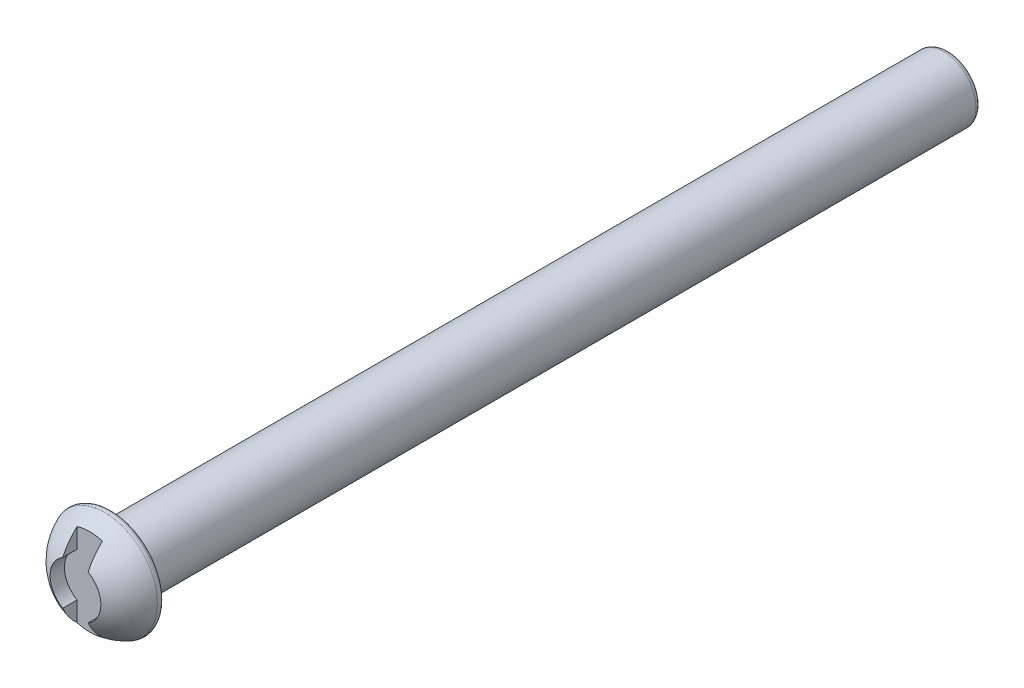
ISO-10303-21;
HEADER;
FILE_DESCRIPTION(('STEP AP214'),'2;1');
FILE_NAME('part.step','',(''),(''),'','','');
FILE_SCHEMA(('AUTOMOTIVE_DESIGN { 1 0 10303 214 1 1 1 1 }'));
ENDSEC;
DATA;
#1=APPLICATION_CONTEXT('core data for automotive mechanical design processes');
#2=APPLICATION_PROTOCOL_DEFINITION('international standard','automotive_design',2000,#1);
#3=PRODUCT_CONTEXT('',#1,'mechanical');
#4=PRODUCT('Part','Part','',(#3));
#5=PRODUCT_RELATED_PRODUCT_CATEGORY('part','',(#4));
#6=PRODUCT_DEFINITION_FORMATION('','',#4);
#7=PRODUCT_DEFINITION_CONTEXT('part definition',#1,'design');
#8=PRODUCT_DEFINITION('design','',#6,#7);
#9=PRODUCT_DEFINITION_SHAPE('','',#8);
#10=(LENGTH_UNIT() NAMED_UNIT(*) SI_UNIT(.MILLI.,.METRE.));
#11=(NAMED_UNIT(*) PLANE_ANGLE_UNIT() SI_UNIT($,.RADIAN.));
#12=(NAMED_UNIT(*) SI_UNIT($,.STERADIAN.) SOLID_ANGLE_UNIT());
#13=UNCERTAINTY_MEASURE_WITH_UNIT(LENGTH_MEASURE(1.E-05),#10,'distance_accuracy_value','');
#14=(GEOMETRIC_REPRESENTATION_CONTEXT(3) GLOBAL_UNCERTAINTY_ASSIGNED_CONTEXT((#13)) GLOBAL_UNIT_ASSIGNED_CONTEXT((#10,
#11,#12)) REPRESENTATION_CONTEXT('',''));
#15=CARTESIAN_POINT('',(0.,0.,0.));
#16=DIRECTION('',(0.,0.,1.));
#17=DIRECTION('',(1.,0.,0.));
#18=AXIS2_PLACEMENT_3D('',#15,#16,#17);
#19=CARTESIAN_POINT('',(0.,0.,-1.68125));
#20=DIRECTION('',(0.,0.,1.));
#21=DIRECTION('',(0.,1.,0.));
#22=AXIS2_PLACEMENT_3D('',#19,#20,#21);
#23=SPHERICAL_SURFACE('',#22,1.68125);
#24=CARTESIAN_POINT('',(0.,0.,-1.0430612244898));
#25=DIRECTION('',(0.,0.,-1.));
#26=DIRECTION('',(-1.,0.,0.));
#27=AXIS2_PLACEMENT_3D('',#24,#25,#26);
#28=CIRCLE('',#27,1.55541526587365);
#29=CARTESIAN_POINT('',(-1.55541526587365,0.,-1.0430612244898));
#30=VERTEX_POINT('',#29);
#31=EDGE_CURVE('E43',#30,#30,#28,.F.);
#32=ORIENTED_EDGE('',*,*,#31,.T.);
#33=EDGE_LOOP('',(#32));
#34=FACE_BOUND('',#33,.T.);
#35=CARTESIAN_POINT('',(-0.375,0.,-1.68125));
#36=DIRECTION('',(-1.,0.,0.));
#37=DIRECTION('',(0.,-1.,0.));
#38=AXIS2_PLACEMENT_3D('',#35,#36,#37);
#39=CIRCLE('',#38,1.63889492112826);
#40=CARTESIAN_POINT('',(-0.375,-1.23161479367536,-0.6));
#41=VERTEX_POINT('',#40);
#42=CARTESIAN_POINT('',(-0.375,-0.64951905283833,-0.176556821142596));
#43=VERTEX_POINT('',#42);
#44=EDGE_CURVE('E136',#41,#43,#39,.T.);
#45=ORIENTED_EDGE('',*,*,#44,.T.);
#46=CARTESIAN_POINT('',(0.,0.,-0.176556821142596));
#47=DIRECTION('',(0.,0.,-1.));
#48=DIRECTION('',(-1.,0.,0.));
#49=AXIS2_PLACEMENT_3D('',#46,#47,#48);
#50=CIRCLE('',#49,0.75);
#51=CARTESIAN_POINT('',(-0.375,0.649519052838329,-0.176556821142596));
#52=VERTEX_POINT('',#51);
#53=EDGE_CURVE('E58',#43,#52,#50,.T.);
#54=ORIENTED_EDGE('',*,*,#53,.T.);
#55=CARTESIAN_POINT('',(-0.375,0.,-1.68125));
#56=DIRECTION('',(-1.,0.,0.));
#57=DIRECTION('',(0.,-1.,0.));
#58=AXIS2_PLACEMENT_3D('',#55,#56,#57);
#59=CIRCLE('',#58,1.63889492112826);
#60=CARTESIAN_POINT('',(-0.375,1.23161479367536,-0.6));
#61=VERTEX_POINT('',#60);
#62=EDGE_CURVE('E139',#52,#61,#59,.T.);
#63=ORIENTED_EDGE('',*,*,#62,.T.);
#64=CARTESIAN_POINT('',(0.,0.,-0.6));
#65=DIRECTION('',(0.,0.,1.));
#66=DIRECTION('',(1.,0.,0.));
#67=AXIS2_PLACEMENT_3D('',#64,#65,#66);
#68=CIRCLE('',#67,1.28743931895837);
#69=CARTESIAN_POINT('',(0.375,1.23161479367536,-0.6));
#70=VERTEX_POINT('',#69);
#71=EDGE_CURVE('E129',#70,#61,#68,.T.);
#72=ORIENTED_EDGE('',*,*,#71,.F.);
#73=CARTESIAN_POINT('',(0.375,0.,-1.68125));
#74=DIRECTION('',(1.,0.,0.));
#75=DIRECTION('',(0.,1.,0.));
#76=AXIS2_PLACEMENT_3D('',#73,#74,#75);
#77=CIRCLE('',#76,1.63889492112826);
#78=CARTESIAN_POINT('',(0.375,0.649519052838329,-0.176556821142596));
#79=VERTEX_POINT('',#78);
#80=EDGE_CURVE('E133',#70,#79,#77,.T.);
#81=ORIENTED_EDGE('',*,*,#80,.T.);
#82=CARTESIAN_POINT('',(0.,0.,-0.176556821142596));
#83=DIRECTION('',(0.,0.,-1.));
#84=DIRECTION('',(-1.,0.,0.));
#85=AXIS2_PLACEMENT_3D('',#82,#83,#84);
#86=CIRCLE('',#85,0.75);
#87=CARTESIAN_POINT('',(0.375,-0.64951905283833,-0.176556821142596));
#88=VERTEX_POINT('',#87);
#89=EDGE_CURVE('E131',#79,#88,#86,.T.);
#90=ORIENTED_EDGE('',*,*,#89,.T.);
#91=CARTESIAN_POINT('',(0.375,0.,-1.68125));
#92=DIRECTION('',(1.,0.,0.));
#93=DIRECTION('',(0.,1.,0.));
#94=AXIS2_PLACEMENT_3D('',#91,#92,#93);
#95=CIRCLE('',#94,1.63889492112826);
#96=CARTESIAN_POINT('',(0.375,-1.23161479367536,-0.6));
#97=VERTEX_POINT('',#96);
#98=EDGE_CURVE('E103',#88,#97,#95,.T.);
#99=ORIENTED_EDGE('',*,*,#98,.T.);
#100=EDGE_CURVE('E96',#41,#97,#68,.T.);
#101=ORIENTED_EDGE('',*,*,#100,.F.);
#102=EDGE_LOOP('',(#45,#54,#63,#72,#81,#90,#99,#101));
#103=FACE_BOUND('',#102,.T.);
#104=ADVANCED_FACE('F35',(#34,#103),#23,.T.);
#105=CARTESIAN_POINT('',(0.,0.,-26.));
#106=DIRECTION('',(0.,0.,1.));
#107=DIRECTION('',(1.,0.,0.));
#108=AXIS2_PLACEMENT_3D('',#105,#106,#107);
#109=PLANE('',#108);
#110=CARTESIAN_POINT('',(0.,0.,-26.));
#111=DIRECTION('',(0.,0.,1.));
#112=DIRECTION('',(1.,0.,0.));
#113=AXIS2_PLACEMENT_3D('',#110,#111,#112);
#114=CIRCLE('',#113,0.799999999999999);
#115=CARTESIAN_POINT('',(0.799999999999999,0.,-26.));
#116=VERTEX_POINT('',#115);
#117=EDGE_CURVE('E146',#116,#116,#114,.F.);
#118=ORIENTED_EDGE('',*,*,#117,.T.);
#119=EDGE_LOOP('',(#118));
#120=FACE_BOUND('',#119,.T.);
#121=ADVANCED_FACE('F162',(#120),#109,.F.);
#122=CARTESIAN_POINT('',(0.,0.,0.));
#123=DIRECTION('',(0.,0.,1.));
#124=DIRECTION('',(1.,0.,0.));
#125=AXIS2_PLACEMENT_3D('',#122,#123,#124);
#126=CYLINDRICAL_SURFACE('',#125,0.949999999999999);
#127=CARTESIAN_POINT('',(0.,0.,-25.85));
#128=DIRECTION('',(0.,0.,1.));
#129=DIRECTION('',(1.,0.,0.));
#130=AXIS2_PLACEMENT_3D('',#127,#128,#129);
#131=CIRCLE('',#130,0.949999999999999);
#132=CARTESIAN_POINT('',(0.949999999999999,0.,-25.85));
#133=VERTEX_POINT('',#132);
#134=EDGE_CURVE('E143',#133,#133,#131,.T.);
#135=ORIENTED_EDGE('',*,*,#134,.T.);
#136=EDGE_LOOP('',(#135));
#137=FACE_BOUND('',#136,.T.);
#138=CARTESIAN_POINT('',(0.,0.,-1.25));
#139=DIRECTION('',(0.,0.,1.));
#140=DIRECTION('',(1.,0.,0.));
#141=AXIS2_PLACEMENT_3D('',#138,#139,#140);
#142=CIRCLE('',#141,0.949999999999999);
#143=CARTESIAN_POINT('',(0.949999999999999,0.,-1.25));
#144=VERTEX_POINT('',#143);
#145=EDGE_CURVE('E122',#144,#144,#142,.T.);
#146=ORIENTED_EDGE('',*,*,#145,.F.);
#147=EDGE_LOOP('',(#146));
#148=FACE_BOUND('',#147,.T.);
#149=ADVANCED_FACE('F167',(#137,#148),#126,.T.);
#150=CARTESIAN_POINT('',(0.,0.949999999999999,-1.25));
#151=DIRECTION('',(0.,0.,1.));
#152=DIRECTION('',(1.,0.,0.));
#153=AXIS2_PLACEMENT_3D('',#150,#151,#152);
#154=PLANE('',#153);
#155=CARTESIAN_POINT('',(0.,0.,-1.25));
#156=DIRECTION('',(0.,0.,1.));
#157=DIRECTION('',(1.,0.,0.));
#158=AXIS2_PLACEMENT_3D('',#155,#156,#157);
#159=CIRCLE('',#158,1.41664215665072);
#160=CARTESIAN_POINT('',(1.41664215665072,0.,-1.25));
#161=VERTEX_POINT('',#160);
#162=EDGE_CURVE('E11',#161,#161,#159,.F.);
#163=ORIENTED_EDGE('',*,*,#162,.T.);
#164=EDGE_LOOP('',(#163));
#165=FACE_BOUND('',#164,.T.);
#166=ORIENTED_EDGE('',*,*,#145,.T.);
#167=EDGE_LOOP('',(#166));
#168=FACE_BOUND('',#167,.T.);
#169=ADVANCED_FACE('F173',(#165,#168),#154,.F.);
#170=CARTESIAN_POINT('',(-0.375,-0.64951905283833,-0.6));
#171=DIRECTION('',(-1.,0.,0.));
#172=DIRECTION('',(0.,-1.,0.));
#173=AXIS2_PLACEMENT_3D('',#170,#171,#172);
#174=PLANE('',#173);
#175=DIRECTION('',(0.,-1.,0.));
#176=VECTOR('',#175,1.);
#177=CARTESIAN_POINT('',(-0.375,-0.64951905283833,-0.6));
#178=LINE('',#177,#176);
#179=CARTESIAN_POINT('',(-0.375,-0.64951905283833,-0.6));
#180=VERTEX_POINT('',#179);
#181=EDGE_CURVE('E50',#180,#41,#178,.T.);
#182=ORIENTED_EDGE('',*,*,#181,.F.);
#183=DIRECTION('',(0.,0.,1.));
#184=VECTOR('',#183,1.);
#185=CARTESIAN_POINT('',(-0.375,-0.64951905283833,-0.6));
#186=LINE('',#185,#184);
#187=EDGE_CURVE('E120',#180,#43,#186,.T.);
#188=ORIENTED_EDGE('',*,*,#187,.T.);
#189=ORIENTED_EDGE('',*,*,#44,.F.);
#190=EDGE_LOOP('',(#182,#188,#189));
#191=FACE_BOUND('',#190,.T.);
#192=ADVANCED_FACE('F177',(#191),#174,.F.);
#193=CARTESIAN_POINT('',(0.,0.,-0.6));
#194=DIRECTION('',(0.,0.,1.));
#195=DIRECTION('',(1.,0.,0.));
#196=AXIS2_PLACEMENT_3D('',#193,#194,#195);
#197=CYLINDRICAL_SURFACE('',#196,0.75);
#198=ORIENTED_EDGE('',*,*,#187,.F.);
#199=CARTESIAN_POINT('',(0.,0.,-0.6));
#200=DIRECTION('',(0.,0.,1.));
#201=DIRECTION('',(1.,0.,0.));
#202=AXIS2_PLACEMENT_3D('',#199,#200,#201);
#203=CIRCLE('',#202,0.75);
#204=CARTESIAN_POINT('',(-0.375,0.649519052838329,-0.6));
#205=VERTEX_POINT('',#204);
#206=EDGE_CURVE('E117',#205,#180,#203,.T.);
#207=ORIENTED_EDGE('',*,*,#206,.F.);
#208=DIRECTION('',(0.,0.,1.));
#209=VECTOR('',#208,1.);
#210=CARTESIAN_POINT('',(-0.375,0.649519052838329,-0.6));
#211=LINE('',#210,#209);
#212=EDGE_CURVE('E123',#205,#52,#211,.T.);
#213=ORIENTED_EDGE('',*,*,#212,.T.);
#214=ORIENTED_EDGE('',*,*,#53,.F.);
#215=EDGE_LOOP('',(#198,#207,#213,#214));
#216=FACE_BOUND('',#215,.T.);
#217=ADVANCED_FACE('F190',(#216),#197,.F.);
#218=CARTESIAN_POINT('',(-0.375,1.91030489302506,-0.6));
#219=DIRECTION('',(-1.,0.,0.));
#220=DIRECTION('',(0.,-1.,0.));
#221=AXIS2_PLACEMENT_3D('',#218,#219,#220);
#222=PLANE('',#221);
#223=ORIENTED_EDGE('',*,*,#212,.F.);
#224=DIRECTION('',(0.,-1.,0.));
#225=VECTOR('',#224,1.);
#226=CARTESIAN_POINT('',(-0.375,1.91030489302506,-0.6));
#227=LINE('',#226,#225);
#228=EDGE_CURVE('E113',#61,#205,#227,.T.);
#229=ORIENTED_EDGE('',*,*,#228,.F.);
#230=ORIENTED_EDGE('',*,*,#62,.F.);
#231=EDGE_LOOP('',(#223,#229,#230));
#232=FACE_BOUND('',#231,.T.);
#233=ADVANCED_FACE('F186',(#232),#222,.F.);
#234=CARTESIAN_POINT('',(0.375,1.91030489302506,-0.6));
#235=DIRECTION('',(1.,0.,0.));
#236=DIRECTION('',(0.,1.,0.));
#237=AXIS2_PLACEMENT_3D('',#234,#235,#236);
#238=PLANE('',#237);
#239=DIRECTION('',(0.,1.,0.));
#240=VECTOR('',#239,1.);
#241=CARTESIAN_POINT('',(0.375,1.91030489302506,-0.6));
#242=LINE('',#241,#240);
#243=CARTESIAN_POINT('',(0.375,0.649519052838329,-0.6));
#244=VERTEX_POINT('',#243);
#245=EDGE_CURVE('E111',#244,#70,#242,.T.);
#246=ORIENTED_EDGE('',*,*,#245,.F.);
#247=DIRECTION('',(0.,0.,1.));
#248=VECTOR('',#247,1.);
#249=CARTESIAN_POINT('',(0.375,0.649519052838329,-0.6));
#250=LINE('',#249,#248);
#251=EDGE_CURVE('E106',#244,#79,#250,.T.);
#252=ORIENTED_EDGE('',*,*,#251,.T.);
#253=ORIENTED_EDGE('',*,*,#80,.F.);
#254=EDGE_LOOP('',(#246,#252,#253));
#255=FACE_BOUND('',#254,.T.);
#256=ADVANCED_FACE('F183',(#255),#238,.F.);
#257=CARTESIAN_POINT('',(0.,0.,-0.6));
#258=DIRECTION('',(0.,0.,1.));
#259=DIRECTION('',(1.,0.,0.));
#260=AXIS2_PLACEMENT_3D('',#257,#258,#259);
#261=CYLINDRICAL_SURFACE('',#260,0.75);
#262=ORIENTED_EDGE('',*,*,#251,.F.);
#263=CARTESIAN_POINT('',(0.,0.,-0.6));
#264=DIRECTION('',(0.,0.,1.));
#265=DIRECTION('',(1.,0.,0.));
#266=AXIS2_PLACEMENT_3D('',#263,#264,#265);
#267=CIRCLE('',#266,0.75);
#268=CARTESIAN_POINT('',(0.375,-0.64951905283833,-0.6));
#269=VERTEX_POINT('',#268);
#270=EDGE_CURVE('E94',#269,#244,#267,.T.);
#271=ORIENTED_EDGE('',*,*,#270,.F.);
#272=DIRECTION('',(0.,0.,1.));
#273=VECTOR('',#272,1.);
#274=CARTESIAN_POINT('',(0.375,-0.64951905283833,-0.6));
#275=LINE('',#274,#273);
#276=EDGE_CURVE('E101',#269,#88,#275,.T.);
#277=ORIENTED_EDGE('',*,*,#276,.T.);
#278=ORIENTED_EDGE('',*,*,#89,.F.);
#279=EDGE_LOOP('',(#262,#271,#277,#278));
#280=FACE_BOUND('',#279,.T.);
#281=ADVANCED_FACE('F108',(#280),#261,.F.);
#282=CARTESIAN_POINT('',(0.375,-0.64951905283833,-0.6));
#283=DIRECTION('',(1.,0.,0.));
#284=DIRECTION('',(0.,1.,0.));
#285=AXIS2_PLACEMENT_3D('',#282,#283,#284);
#286=PLANE('',#285);
#287=ORIENTED_EDGE('',*,*,#276,.F.);
#288=DIRECTION('',(0.,1.,0.));
#289=VECTOR('',#288,1.);
#290=CARTESIAN_POINT('',(0.375,-0.64951905283833,-0.6));
#291=LINE('',#290,#289);
#292=EDGE_CURVE('E89',#97,#269,#291,.T.);
#293=ORIENTED_EDGE('',*,*,#292,.F.);
#294=ORIENTED_EDGE('',*,*,#98,.F.);
#295=EDGE_LOOP('',(#287,#293,#294));
#296=FACE_BOUND('',#295,.T.);
#297=ADVANCED_FACE('F102',(#296),#286,.F.);
#298=CARTESIAN_POINT('',(0.,0.,-0.6));
#299=DIRECTION('',(0.,0.,1.));
#300=DIRECTION('',(1.,0.,0.));
#301=AXIS2_PLACEMENT_3D('',#298,#299,#300);
#302=PLANE('',#301);
#303=ORIENTED_EDGE('',*,*,#71,.T.);
#304=ORIENTED_EDGE('',*,*,#228,.T.);
#305=ORIENTED_EDGE('',*,*,#206,.T.);
#306=ORIENTED_EDGE('',*,*,#181,.T.);
#307=ORIENTED_EDGE('',*,*,#100,.T.);
#308=ORIENTED_EDGE('',*,*,#292,.T.);
#309=ORIENTED_EDGE('',*,*,#270,.T.);
#310=ORIENTED_EDGE('',*,*,#245,.T.);
#311=EDGE_LOOP('',(#303,#304,#305,#306,#307,#308,#309,#310));
#312=FACE_BOUND('',#311,.T.);
#313=ADVANCED_FACE('F91',(#312),#302,.T.);
#314=CARTESIAN_POINT('',(0.,0.,-25.85));
#315=DIRECTION('',(0.,0.,1.));
#316=DIRECTION('',(1.,0.,0.));
#317=AXIS2_PLACEMENT_3D('',#314,#315,#316);
#318=TOROIDAL_SURFACE('',#317,0.799999999999999,0.15);
#319=ORIENTED_EDGE('',*,*,#117,.F.);
#320=EDGE_LOOP('',(#319));
#321=FACE_BOUND('',#320,.T.);
#322=ORIENTED_EDGE('',*,*,#134,.F.);
#323=EDGE_LOOP('',(#322));
#324=FACE_BOUND('',#323,.T.);
#325=ADVANCED_FACE('F154',(#321,#324),#318,.T.);
#326=CARTESIAN_POINT('',(0.,0.,-1.1));
#327=DIRECTION('',(0.,0.,1.));
#328=DIRECTION('',(1.,0.,0.));
#329=AXIS2_PLACEMENT_3D('',#326,#327,#328);
#330=TOROIDAL_SURFACE('',#329,1.41664215665072,0.15);
#331=ORIENTED_EDGE('',*,*,#162,.F.);
#332=EDGE_LOOP('',(#331));
#333=FACE_BOUND('',#332,.T.);
#334=ORIENTED_EDGE('',*,*,#31,.F.);
#335=EDGE_LOOP('',(#334));
#336=FACE_BOUND('',#335,.T.);
#337=ADVANCED_FACE('F37',(#333,#336),#330,.T.);
#338=CLOSED_SHELL('',(#104,#121,#149,#169,#192,#217,#233,#256,#281,#297,#313,#325,#337));
#339=MANIFOLD_SOLID_BREP('B2',#338);
#340=ADVANCED_BREP_SHAPE_REPRESENTATION('',(#18,#339),#14);
#341=SHAPE_DEFINITION_REPRESENTATION(#9,#340);
ENDSEC;
END-ISO-10303-21;
